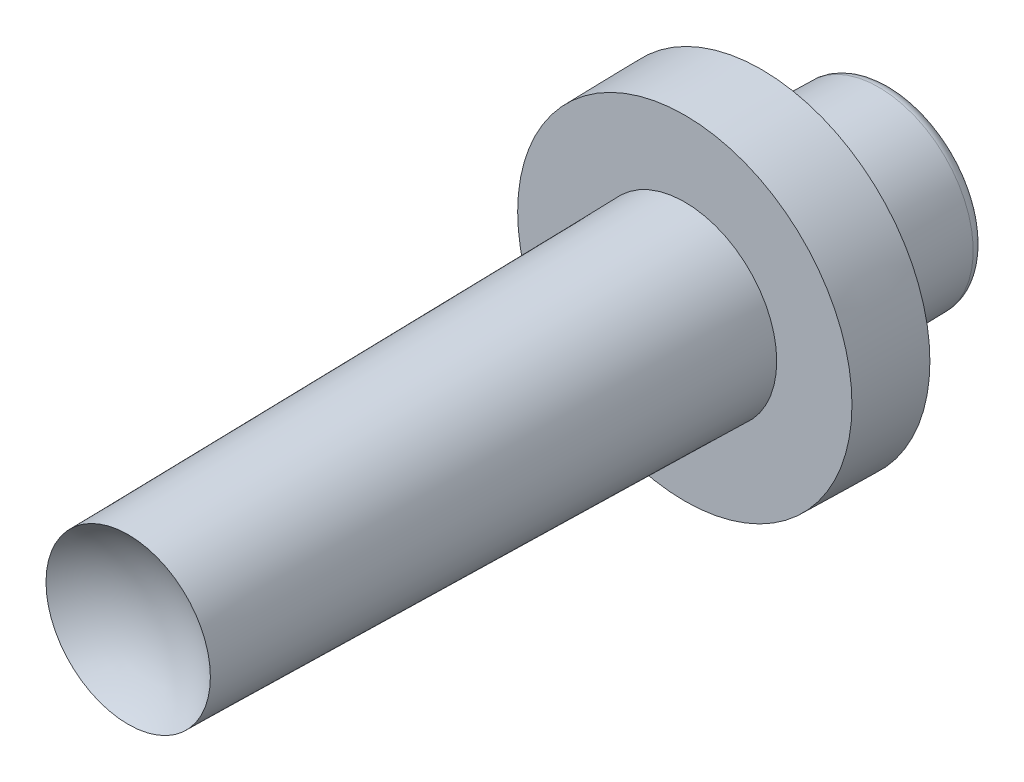
ISO-10303-21;
HEADER;
FILE_DESCRIPTION(('STEP AP214'),'2;1');
FILE_NAME('part.step','',(''),(''),'','','');
FILE_SCHEMA(('AUTOMOTIVE_DESIGN { 1 0 10303 214 1 1 1 1 }'));
ENDSEC;
DATA;
#1=APPLICATION_CONTEXT('core data for automotive mechanical design processes');
#2=APPLICATION_PROTOCOL_DEFINITION('international standard','automotive_design',2000,#1);
#3=PRODUCT_CONTEXT('',#1,'mechanical');
#4=PRODUCT('Part','Part','',(#3));
#5=PRODUCT_RELATED_PRODUCT_CATEGORY('part','',(#4));
#6=PRODUCT_DEFINITION_FORMATION('','',#4);
#7=PRODUCT_DEFINITION_CONTEXT('part definition',#1,'design');
#8=PRODUCT_DEFINITION('design','',#6,#7);
#9=PRODUCT_DEFINITION_SHAPE('','',#8);
#10=(LENGTH_UNIT() NAMED_UNIT(*) SI_UNIT(.MILLI.,.METRE.));
#11=(NAMED_UNIT(*) PLANE_ANGLE_UNIT() SI_UNIT($,.RADIAN.));
#12=(NAMED_UNIT(*) SI_UNIT($,.STERADIAN.) SOLID_ANGLE_UNIT());
#13=UNCERTAINTY_MEASURE_WITH_UNIT(LENGTH_MEASURE(1.E-05),#10,'distance_accuracy_value','');
#14=(GEOMETRIC_REPRESENTATION_CONTEXT(3) GLOBAL_UNCERTAINTY_ASSIGNED_CONTEXT((#13)) GLOBAL_UNIT_ASSIGNED_CONTEXT((#10,
#11,#12)) REPRESENTATION_CONTEXT('',''));
#15=CARTESIAN_POINT('',(0.,0.,0.));
#16=DIRECTION('',(0.,0.,1.));
#17=DIRECTION('',(1.,0.,0.));
#18=AXIS2_PLACEMENT_3D('',#15,#16,#17);
#19=CARTESIAN_POINT('',(0.,0.,0.));
#20=DIRECTION('',(0.,0.,1.));
#21=DIRECTION('',(1.,0.,0.));
#22=AXIS2_PLACEMENT_3D('',#19,#20,#21);
#23=PLANE('',#22);
#24=CARTESIAN_POINT('',(0.,0.,0.));
#25=DIRECTION('',(0.,0.,1.));
#26=DIRECTION('',(1.,0.,0.));
#27=AXIS2_PLACEMENT_3D('',#24,#25,#26);
#28=CIRCLE('',#27,2.794);
#29=CARTESIAN_POINT('',(2.794,0.,0.));
#30=VERTEX_POINT('',#29);
#31=EDGE_CURVE('E51',#30,#30,#28,.T.);
#32=ORIENTED_EDGE('',*,*,#31,.F.);
#33=EDGE_LOOP('',(#32));
#34=FACE_BOUND('',#33,.T.);
#35=CARTESIAN_POINT('',(0.,0.,0.));
#36=DIRECTION('',(0.,0.,1.));
#37=DIRECTION('',(1.,0.,0.));
#38=AXIS2_PLACEMENT_3D('',#35,#36,#37);
#39=CIRCLE('',#38,1.6);
#40=CARTESIAN_POINT('',(1.6,0.,0.));
#41=VERTEX_POINT('',#40);
#42=EDGE_CURVE('E42',#41,#41,#39,.F.);
#43=ORIENTED_EDGE('',*,*,#42,.F.);
#44=EDGE_LOOP('',(#43));
#45=FACE_BOUND('',#44,.T.);
#46=ADVANCED_FACE('F31',(#34,#45),#23,.F.);
#47=CARTESIAN_POINT('',(0.,0.,1.27));
#48=DIRECTION('',(0.,0.,1.));
#49=DIRECTION('',(1.,0.,0.));
#50=AXIS2_PLACEMENT_3D('',#47,#48,#49);
#51=PLANE('',#50);
#52=CARTESIAN_POINT('',(0.,0.,1.27));
#53=DIRECTION('',(0.,0.,1.));
#54=DIRECTION('',(1.,0.,0.));
#55=AXIS2_PLACEMENT_3D('',#52,#53,#54);
#56=CIRCLE('',#55,2.77183206754116);
#57=CARTESIAN_POINT('',(2.77183206754116,0.,1.27));
#58=VERTEX_POINT('',#57);
#59=EDGE_CURVE('E46',#58,#58,#56,.T.);
#60=ORIENTED_EDGE('',*,*,#59,.T.);
#61=EDGE_LOOP('',(#60));
#62=FACE_BOUND('',#61,.T.);
#63=CARTESIAN_POINT('',(0.,0.,1.27));
#64=DIRECTION('',(0.,0.,1.));
#65=DIRECTION('',(1.,0.,0.));
#66=AXIS2_PLACEMENT_3D('',#63,#64,#65);
#67=CIRCLE('',#66,1.524);
#68=CARTESIAN_POINT('',(1.524,0.,1.27));
#69=VERTEX_POINT('',#68);
#70=EDGE_CURVE('E54',#69,#69,#67,.T.);
#71=ORIENTED_EDGE('',*,*,#70,.F.);
#72=EDGE_LOOP('',(#71));
#73=FACE_BOUND('',#72,.T.);
#74=ADVANCED_FACE('F76',(#62,#73),#51,.T.);
#75=CARTESIAN_POINT('',(0.,0.,0.));
#76=DIRECTION('',(0.,0.,-1.));
#77=DIRECTION('',(1.,0.,0.));
#78=AXIS2_PLACEMENT_3D('',#75,#76,#77);
#79=CONICAL_SURFACE('',#78,2.794,0.0174532925199433);
#80=ORIENTED_EDGE('',*,*,#59,.F.);
#81=EDGE_LOOP('',(#80));
#82=FACE_BOUND('',#81,.T.);
#83=ORIENTED_EDGE('',*,*,#31,.T.);
#84=EDGE_LOOP('',(#83));
#85=FACE_BOUND('',#84,.T.);
#86=ADVANCED_FACE('F82',(#82,#85),#79,.T.);
#87=CARTESIAN_POINT('',(0.,0.,1.27));
#88=DIRECTION('',(0.,0.,-1.));
#89=DIRECTION('',(1.,0.,0.));
#90=AXIS2_PLACEMENT_3D('',#87,#88,#89);
#91=CONICAL_SURFACE('',#90,1.524,0.0174532925199433);
#92=CARTESIAN_POINT('',(0.,0.,10.50000005));
#93=DIRECTION('',(0.,0.,-1.));
#94=DIRECTION('',(-1.,0.,0.));
#95=AXIS2_PLACEMENT_3D('',#92,#93,#94);
#96=CIRCLE('',#95,1.3628897498398);
#97=CARTESIAN_POINT('',(-1.3628897498398,0.,10.50000005));
#98=VERTEX_POINT('',#97);
#99=EDGE_CURVE('E57',#98,#98,#96,.T.);
#100=ORIENTED_EDGE('',*,*,#99,.T.);
#101=EDGE_LOOP('',(#100));
#102=FACE_BOUND('',#101,.T.);
#103=ORIENTED_EDGE('',*,*,#70,.T.);
#104=EDGE_LOOP('',(#103));
#105=FACE_BOUND('',#104,.T.);
#106=ADVANCED_FACE('F61',(#102,#105),#91,.T.);
#107=CARTESIAN_POINT('',(0.,0.,0.));
#108=DIRECTION('',(0.,0.,1.));
#109=DIRECTION('',(-1.,0.,0.));
#110=AXIS2_PLACEMENT_3D('',#107,#108,#109);
#111=CONICAL_SURFACE('',#110,1.6,0.0174532925199433);
#112=CARTESIAN_POINT('',(0.,0.,-1.94618360171869));
#113=DIRECTION('',(0.,0.,-1.));
#114=DIRECTION('',(-1.,0.,0.));
#115=AXIS2_PLACEMENT_3D('',#112,#113,#114);
#116=CIRCLE('',#115,1.56602923886977);
#117=CARTESIAN_POINT('',(-1.56602923886977,0.,-1.94618360171869));
#118=VERTEX_POINT('',#117);
#119=EDGE_CURVE('E10',#118,#118,#116,.F.);
#120=ORIENTED_EDGE('',*,*,#119,.T.);
#121=EDGE_LOOP('',(#120));
#122=FACE_BOUND('',#121,.T.);
#123=ORIENTED_EDGE('',*,*,#42,.T.);
#124=EDGE_LOOP('',(#123));
#125=FACE_BOUND('',#124,.T.);
#126=ADVANCED_FACE('F67',(#122,#125),#111,.T.);
#127=CARTESIAN_POINT('',(0.,0.,11.8826155029513));
#128=DIRECTION('',(0.,0.,-1.));
#129=DIRECTION('',(1.,0.,0.));
#130=AXIS2_PLACEMENT_3D('',#127,#128,#129);
#131=SPHERICAL_SURFACE('',#130,1.9414154529513);
#132=ORIENTED_EDGE('',*,*,#99,.F.);
#133=EDGE_LOOP('',(#132));
#134=FACE_BOUND('',#133,.T.);
#135=ADVANCED_FACE('F64',(#134),#131,.F.);
#136=CARTESIAN_POINT('',(0.,0.,3.91011399839635));
#137=DIRECTION('',(0.,0.,1.));
#138=DIRECTION('',(-1.,0.,0.));
#139=AXIS2_PLACEMENT_3D('',#136,#137,#138);
#140=SPHERICAL_SURFACE('',#139,6.21011399839636);
#141=CARTESIAN_POINT('',(0.,0.,-2.1374583818018));
#142=DIRECTION('',(0.,0.,1.));
#143=DIRECTION('',(1.,0.,0.));
#144=AXIS2_PLACEMENT_3D('',#141,#142,#143);
#145=CIRCLE('',#144,1.41151839497145);
#146=CARTESIAN_POINT('',(1.41151839497145,0.,-2.1374583818018));
#147=VERTEX_POINT('',#146);
#148=EDGE_CURVE('E38',#147,#147,#145,.F.);
#149=ORIENTED_EDGE('',*,*,#148,.T.);
#150=EDGE_LOOP('',(#149));
#151=FACE_BOUND('',#150,.T.);
#152=ADVANCED_FACE('F66',(#151),#140,.T.);
#153=CARTESIAN_POINT('',(0.,0.,-1.94269312043124));
#154=DIRECTION('',(0.,0.,1.));
#155=DIRECTION('',(1.,0.,0.));
#156=AXIS2_PLACEMENT_3D('',#153,#154,#155);
#157=TOROIDAL_SURFACE('',#156,1.36605969983849,0.2);
#158=ORIENTED_EDGE('',*,*,#119,.F.);
#159=EDGE_LOOP('',(#158));
#160=FACE_BOUND('',#159,.T.);
#161=ORIENTED_EDGE('',*,*,#148,.F.);
#162=EDGE_LOOP('',(#161));
#163=FACE_BOUND('',#162,.T.);
#164=ADVANCED_FACE('F33',(#160,#163),#157,.T.);
#165=CLOSED_SHELL('',(#46,#74,#86,#106,#126,#135,#152,#164));
#166=MANIFOLD_SOLID_BREP('B2',#165);
#167=ADVANCED_BREP_SHAPE_REPRESENTATION('',(#18,#166),#14);
#168=SHAPE_DEFINITION_REPRESENTATION(#9,#167);
ENDSEC;
END-ISO-10303-21;
